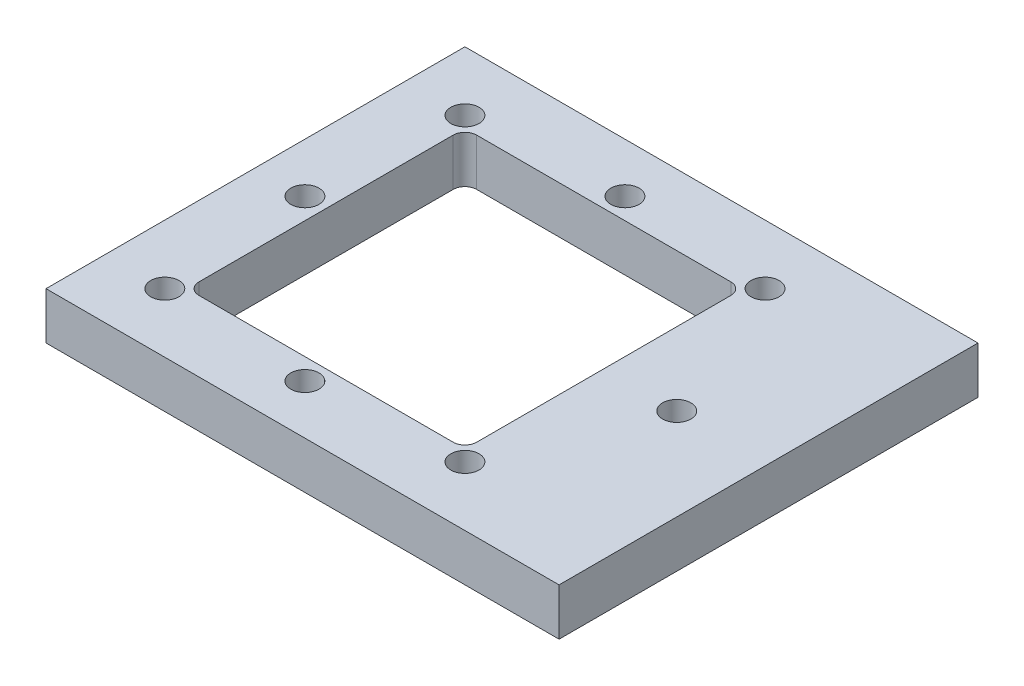
ISO-10303-21;
HEADER;
FILE_DESCRIPTION(('STEP AP214'),'2;1');
FILE_NAME('part.step','',(''),(''),'','','');
FILE_SCHEMA(('AUTOMOTIVE_DESIGN { 1 0 10303 214 1 1 1 1 }'));
ENDSEC;
DATA;
#1=APPLICATION_CONTEXT('core data for automotive mechanical design processes');
#2=APPLICATION_PROTOCOL_DEFINITION('international standard','automotive_design',2000,#1);
#3=PRODUCT_CONTEXT('',#1,'mechanical');
#4=PRODUCT('Part','Part','',(#3));
#5=PRODUCT_RELATED_PRODUCT_CATEGORY('part','',(#4));
#6=PRODUCT_DEFINITION_FORMATION('','',#4);
#7=PRODUCT_DEFINITION_CONTEXT('part definition',#1,'design');
#8=PRODUCT_DEFINITION('design','',#6,#7);
#9=PRODUCT_DEFINITION_SHAPE('','',#8);
#10=(LENGTH_UNIT() NAMED_UNIT(*) SI_UNIT(.MILLI.,.METRE.));
#11=(NAMED_UNIT(*) PLANE_ANGLE_UNIT() SI_UNIT($,.RADIAN.));
#12=(NAMED_UNIT(*) SI_UNIT($,.STERADIAN.) SOLID_ANGLE_UNIT());
#13=UNCERTAINTY_MEASURE_WITH_UNIT(LENGTH_MEASURE(1.E-05),#10,'distance_accuracy_value','');
#14=(GEOMETRIC_REPRESENTATION_CONTEXT(3) GLOBAL_UNCERTAINTY_ASSIGNED_CONTEXT((#13)) GLOBAL_UNIT_ASSIGNED_CONTEXT((#10,
#11,#12)) REPRESENTATION_CONTEXT('',''));
#15=CARTESIAN_POINT('',(0.,0.,0.));
#16=DIRECTION('',(0.,0.,1.));
#17=DIRECTION('',(1.,0.,0.));
#18=AXIS2_PLACEMENT_3D('',#15,#16,#17);
#19=CARTESIAN_POINT('',(0.,5.,0.));
#20=DIRECTION('',(1.,0.,0.));
#21=DIRECTION('',(0.,0.,-1.));
#22=AXIS2_PLACEMENT_3D('',#19,#20,#21);
#23=PLANE('',#22);
#24=DIRECTION('',(0.,0.,1.));
#25=VECTOR('',#24,1.);
#26=CARTESIAN_POINT('',(0.,0.,0.));
#27=LINE('',#26,#25);
#28=CARTESIAN_POINT('',(0.,0.,-44.5));
#29=VERTEX_POINT('',#28);
#30=CARTESIAN_POINT('',(0.,0.,0.));
#31=VERTEX_POINT('',#30);
#32=EDGE_CURVE('E148',#29,#31,#27,.T.);
#33=ORIENTED_EDGE('',*,*,#32,.T.);
#34=DIRECTION('',(0.,-1.,0.));
#35=VECTOR('',#34,1.);
#36=CARTESIAN_POINT('',(0.,5.,0.));
#37=LINE('',#36,#35);
#38=CARTESIAN_POINT('',(0.,5.,0.));
#39=VERTEX_POINT('',#38);
#40=EDGE_CURVE('E129',#39,#31,#37,.T.);
#41=ORIENTED_EDGE('',*,*,#40,.F.);
#42=DIRECTION('',(0.,0.,1.));
#43=VECTOR('',#42,1.);
#44=CARTESIAN_POINT('',(0.,5.,0.));
#45=LINE('',#44,#43);
#46=CARTESIAN_POINT('',(0.,5.,-44.5));
#47=VERTEX_POINT('',#46);
#48=EDGE_CURVE('E136',#47,#39,#45,.T.);
#49=ORIENTED_EDGE('',*,*,#48,.F.);
#50=DIRECTION('',(0.,-1.,0.));
#51=VECTOR('',#50,1.);
#52=CARTESIAN_POINT('',(0.,5.,-44.5));
#53=LINE('',#52,#51);
#54=EDGE_CURVE('E225',#47,#29,#53,.T.);
#55=ORIENTED_EDGE('',*,*,#54,.T.);
#56=EDGE_LOOP('',(#33,#41,#49,#55));
#57=FACE_BOUND('',#56,.T.);
#58=ADVANCED_FACE('F36',(#57),#23,.F.);
#59=CARTESIAN_POINT('',(0.,5.,0.));
#60=DIRECTION('',(0.,0.,-1.));
#61=DIRECTION('',(-1.,0.,0.));
#62=AXIS2_PLACEMENT_3D('',#59,#60,#61);
#63=PLANE('',#62);
#64=DIRECTION('',(1.,0.,0.));
#65=VECTOR('',#64,1.);
#66=CARTESIAN_POINT('',(0.,0.,0.));
#67=LINE('',#66,#65);
#68=CARTESIAN_POINT('',(54.5,0.,0.));
#69=VERTEX_POINT('',#68);
#70=EDGE_CURVE('E227',#31,#69,#67,.T.);
#71=ORIENTED_EDGE('',*,*,#70,.T.);
#72=DIRECTION('',(0.,-1.,0.));
#73=VECTOR('',#72,1.);
#74=CARTESIAN_POINT('',(54.5,5.,0.));
#75=LINE('',#74,#73);
#76=CARTESIAN_POINT('',(54.5,5.,0.));
#77=VERTEX_POINT('',#76);
#78=EDGE_CURVE('E132',#77,#69,#75,.T.);
#79=ORIENTED_EDGE('',*,*,#78,.F.);
#80=DIRECTION('',(1.,0.,0.));
#81=VECTOR('',#80,1.);
#82=CARTESIAN_POINT('',(0.,5.,0.));
#83=LINE('',#82,#81);
#84=EDGE_CURVE('E125',#39,#77,#83,.T.);
#85=ORIENTED_EDGE('',*,*,#84,.F.);
#86=ORIENTED_EDGE('',*,*,#40,.T.);
#87=EDGE_LOOP('',(#71,#79,#85,#86));
#88=FACE_BOUND('',#87,.T.);
#89=ADVANCED_FACE('F127',(#88),#63,.F.);
#90=CARTESIAN_POINT('',(54.5,5.,0.));
#91=DIRECTION('',(-1.,0.,0.));
#92=DIRECTION('',(0.,0.,1.));
#93=AXIS2_PLACEMENT_3D('',#90,#91,#92);
#94=PLANE('',#93);
#95=DIRECTION('',(0.,0.,-1.));
#96=VECTOR('',#95,1.);
#97=CARTESIAN_POINT('',(54.5,0.,0.));
#98=LINE('',#97,#96);
#99=CARTESIAN_POINT('',(54.5,0.,-44.5));
#100=VERTEX_POINT('',#99);
#101=EDGE_CURVE('E229',#69,#100,#98,.T.);
#102=ORIENTED_EDGE('',*,*,#101,.T.);
#103=DIRECTION('',(0.,-1.,0.));
#104=VECTOR('',#103,1.);
#105=CARTESIAN_POINT('',(54.5,5.,-44.5));
#106=LINE('',#105,#104);
#107=CARTESIAN_POINT('',(54.5,5.,-44.5));
#108=VERTEX_POINT('',#107);
#109=EDGE_CURVE('E153',#108,#100,#106,.T.);
#110=ORIENTED_EDGE('',*,*,#109,.F.);
#111=DIRECTION('',(0.,0.,-1.));
#112=VECTOR('',#111,1.);
#113=CARTESIAN_POINT('',(54.5,5.,0.));
#114=LINE('',#113,#112);
#115=EDGE_CURVE('E135',#77,#108,#114,.T.);
#116=ORIENTED_EDGE('',*,*,#115,.F.);
#117=ORIENTED_EDGE('',*,*,#78,.T.);
#118=EDGE_LOOP('',(#102,#110,#116,#117));
#119=FACE_BOUND('',#118,.T.);
#120=ADVANCED_FACE('F241',(#119),#94,.F.);
#121=CARTESIAN_POINT('',(0.,5.,-44.5));
#122=DIRECTION('',(0.,0.,1.));
#123=DIRECTION('',(1.,0.,0.));
#124=AXIS2_PLACEMENT_3D('',#121,#122,#123);
#125=PLANE('',#124);
#126=DIRECTION('',(-1.,0.,0.));
#127=VECTOR('',#126,1.);
#128=CARTESIAN_POINT('',(0.,0.,-44.5));
#129=LINE('',#128,#127);
#130=EDGE_CURVE('E145',#100,#29,#129,.T.);
#131=ORIENTED_EDGE('',*,*,#130,.T.);
#132=ORIENTED_EDGE('',*,*,#54,.F.);
#133=DIRECTION('',(-1.,0.,0.));
#134=VECTOR('',#133,1.);
#135=CARTESIAN_POINT('',(0.,5.,-44.5));
#136=LINE('',#135,#134);
#137=EDGE_CURVE('E141',#108,#47,#136,.T.);
#138=ORIENTED_EDGE('',*,*,#137,.F.);
#139=ORIENTED_EDGE('',*,*,#109,.T.);
#140=EDGE_LOOP('',(#131,#132,#138,#139));
#141=FACE_BOUND('',#140,.T.);
#142=ADVANCED_FACE('F236',(#141),#125,.F.);
#143=CARTESIAN_POINT('',(0.,5.,0.));
#144=DIRECTION('',(0.,-1.,0.));
#145=DIRECTION('',(0.,0.,-1.));
#146=AXIS2_PLACEMENT_3D('',#143,#144,#145);
#147=PLANE('',#146);
#148=CARTESIAN_POINT('',(38.18933982822,5.,-6.31066017177982));
#149=DIRECTION('',(0.,-1.,0.));
#150=DIRECTION('',(0.,0.,-1.));
#151=AXIS2_PLACEMENT_3D('',#148,#149,#150);
#152=CIRCLE('',#151,1.5);
#153=CARTESIAN_POINT('',(38.18933982822,5.,-7.81066017177982));
#154=VERTEX_POINT('',#153);
#155=EDGE_CURVE('E356',#154,#154,#152,.T.);
#156=ORIENTED_EDGE('',*,*,#155,.T.);
#157=EDGE_LOOP('',(#156));
#158=FACE_BOUND('',#157,.T.);
#159=CARTESIAN_POINT('',(6.31066017177981,5.,-6.31066017177983));
#160=DIRECTION('',(0.,-1.,0.));
#161=DIRECTION('',(0.,0.,-1.));
#162=AXIS2_PLACEMENT_3D('',#159,#160,#161);
#163=CIRCLE('',#162,1.5);
#164=CARTESIAN_POINT('',(6.31066017177981,5.,-7.81066017177983));
#165=VERTEX_POINT('',#164);
#166=EDGE_CURVE('E352',#165,#165,#163,.T.);
#167=ORIENTED_EDGE('',*,*,#166,.T.);
#168=EDGE_LOOP('',(#167));
#169=FACE_BOUND('',#168,.T.);
#170=CARTESIAN_POINT('',(38.1893398282201,5.,-38.1893398282201));
#171=DIRECTION('',(0.,-1.,0.));
#172=DIRECTION('',(0.,0.,-1.));
#173=AXIS2_PLACEMENT_3D('',#170,#171,#172);
#174=CIRCLE('',#173,1.5);
#175=CARTESIAN_POINT('',(38.1893398282201,5.,-39.6893398282201));
#176=VERTEX_POINT('',#175);
#177=EDGE_CURVE('E348',#176,#176,#174,.T.);
#178=ORIENTED_EDGE('',*,*,#177,.T.);
#179=EDGE_LOOP('',(#178));
#180=FACE_BOUND('',#179,.T.);
#181=CARTESIAN_POINT('',(6.31066017177982,5.,-38.1893398282201));
#182=DIRECTION('',(0.,-1.,0.));
#183=DIRECTION('',(0.,0.,-1.));
#184=AXIS2_PLACEMENT_3D('',#181,#182,#183);
#185=CIRCLE('',#184,1.5);
#186=CARTESIAN_POINT('',(6.31066017177982,5.,-39.6893398282201));
#187=VERTEX_POINT('',#186);
#188=EDGE_CURVE('E344',#187,#187,#185,.T.);
#189=ORIENTED_EDGE('',*,*,#188,.T.);
#190=EDGE_LOOP('',(#189));
#191=FACE_BOUND('',#190,.T.);
#192=CARTESIAN_POINT('',(22.2499999999999,5.,-5.25000000000002));
#193=DIRECTION('',(0.,-1.,0.));
#194=DIRECTION('',(0.,0.,1.));
#195=AXIS2_PLACEMENT_3D('',#192,#193,#194);
#196=CIRCLE('',#195,1.5);
#197=CARTESIAN_POINT('',(22.2499999999999,5.,-3.75000000000002));
#198=VERTEX_POINT('',#197);
#199=EDGE_CURVE('E340',#198,#198,#196,.T.);
#200=ORIENTED_EDGE('',*,*,#199,.T.);
#201=EDGE_LOOP('',(#200));
#202=FACE_BOUND('',#201,.T.);
#203=CARTESIAN_POINT('',(5.24999999999999,5.,-22.2499999999999));
#204=DIRECTION('',(0.,-1.,0.));
#205=DIRECTION('',(0.,0.,-1.));
#206=AXIS2_PLACEMENT_3D('',#203,#204,#205);
#207=CIRCLE('',#206,1.5);
#208=CARTESIAN_POINT('',(5.24999999999999,5.,-23.7499999999999));
#209=VERTEX_POINT('',#208);
#210=EDGE_CURVE('E336',#209,#209,#207,.T.);
#211=ORIENTED_EDGE('',*,*,#210,.T.);
#212=EDGE_LOOP('',(#211));
#213=FACE_BOUND('',#212,.T.);
#214=CARTESIAN_POINT('',(22.2499999999999,5.,-39.2499999999999));
#215=DIRECTION('',(0.,-1.,0.));
#216=DIRECTION('',(0.,0.,-1.));
#217=AXIS2_PLACEMENT_3D('',#214,#215,#216);
#218=CIRCLE('',#217,1.5);
#219=CARTESIAN_POINT('',(22.2499999999999,5.,-40.7499999999999));
#220=VERTEX_POINT('',#219);
#221=EDGE_CURVE('E333',#220,#220,#218,.T.);
#222=ORIENTED_EDGE('',*,*,#221,.T.);
#223=EDGE_LOOP('',(#222));
#224=FACE_BOUND('',#223,.T.);
#225=CARTESIAN_POINT('',(44.75,5.,-22.2499999999999));
#226=DIRECTION('',(0.,1.,0.));
#227=DIRECTION('',(0.,0.,1.));
#228=AXIS2_PLACEMENT_3D('',#225,#226,#227);
#229=CIRCLE('',#228,1.5);
#230=CARTESIAN_POINT('',(44.75,5.,-20.7499999999999));
#231=VERTEX_POINT('',#230);
#232=EDGE_CURVE('E209',#231,#231,#229,.T.);
#233=ORIENTED_EDGE('',*,*,#232,.F.);
#234=EDGE_LOOP('',(#233));
#235=FACE_BOUND('',#234,.T.);
#236=DIRECTION('',(1.,0.,0.));
#237=VECTOR('',#236,1.);
#238=CARTESIAN_POINT('',(7.5,5.,-7.5));
#239=LINE('',#238,#237);
#240=CARTESIAN_POINT('',(8.75,5.,-7.5));
#241=VERTEX_POINT('',#240);
#242=CARTESIAN_POINT('',(35.75,5.,-7.5));
#243=VERTEX_POINT('',#242);
#244=EDGE_CURVE('E217',#241,#243,#239,.T.);
#245=ORIENTED_EDGE('',*,*,#244,.F.);
#246=CARTESIAN_POINT('',(8.75,5.,-8.75));
#247=DIRECTION('',(0.,-1.,0.));
#248=DIRECTION('',(0.,0.,-1.));
#249=AXIS2_PLACEMENT_3D('',#246,#247,#248);
#250=CIRCLE('',#249,1.25);
#251=CARTESIAN_POINT('',(7.5,5.,-8.75));
#252=VERTEX_POINT('',#251);
#253=EDGE_CURVE('E181',#241,#252,#250,.T.);
#254=ORIENTED_EDGE('',*,*,#253,.T.);
#255=DIRECTION('',(0.,0.,1.));
#256=VECTOR('',#255,1.);
#257=CARTESIAN_POINT('',(7.5,5.,-37.));
#258=LINE('',#257,#256);
#259=CARTESIAN_POINT('',(7.5,5.,-35.75));
#260=VERTEX_POINT('',#259);
#261=EDGE_CURVE('E190',#260,#252,#258,.T.);
#262=ORIENTED_EDGE('',*,*,#261,.F.);
#263=CARTESIAN_POINT('',(8.75,5.,-35.75));
#264=DIRECTION('',(0.,-1.,0.));
#265=DIRECTION('',(0.,0.,-1.));
#266=AXIS2_PLACEMENT_3D('',#263,#264,#265);
#267=CIRCLE('',#266,1.25);
#268=CARTESIAN_POINT('',(8.75,5.,-37.));
#269=VERTEX_POINT('',#268);
#270=EDGE_CURVE('E44',#260,#269,#267,.T.);
#271=ORIENTED_EDGE('',*,*,#270,.T.);
#272=DIRECTION('',(-1.,0.,0.));
#273=VECTOR('',#272,1.);
#274=CARTESIAN_POINT('',(7.5,5.,-37.));
#275=LINE('',#274,#273);
#276=CARTESIAN_POINT('',(35.75,5.,-37.));
#277=VERTEX_POINT('',#276);
#278=EDGE_CURVE('E189',#277,#269,#275,.T.);
#279=ORIENTED_EDGE('',*,*,#278,.F.);
#280=CARTESIAN_POINT('',(35.75,5.,-35.75));
#281=DIRECTION('',(0.,-1.,0.));
#282=DIRECTION('',(0.,0.,-1.));
#283=AXIS2_PLACEMENT_3D('',#280,#281,#282);
#284=CIRCLE('',#283,1.25);
#285=CARTESIAN_POINT('',(37.,5.,-35.75));
#286=VERTEX_POINT('',#285);
#287=EDGE_CURVE('E177',#277,#286,#284,.T.);
#288=ORIENTED_EDGE('',*,*,#287,.T.);
#289=DIRECTION('',(0.,0.,-1.));
#290=VECTOR('',#289,1.);
#291=CARTESIAN_POINT('',(37.,5.,-37.));
#292=LINE('',#291,#290);
#293=CARTESIAN_POINT('',(37.,5.,-8.75));
#294=VERTEX_POINT('',#293);
#295=EDGE_CURVE('E199',#294,#286,#292,.T.);
#296=ORIENTED_EDGE('',*,*,#295,.F.);
#297=CARTESIAN_POINT('',(35.75,5.,-8.75));
#298=DIRECTION('',(0.,-1.,0.));
#299=DIRECTION('',(0.,0.,-1.));
#300=AXIS2_PLACEMENT_3D('',#297,#298,#299);
#301=CIRCLE('',#300,1.25);
#302=EDGE_CURVE('E173',#294,#243,#301,.T.);
#303=ORIENTED_EDGE('',*,*,#302,.T.);
#304=EDGE_LOOP('',(#245,#254,#262,#271,#279,#288,#296,#303));
#305=FACE_BOUND('',#304,.T.);
#306=ORIENTED_EDGE('',*,*,#48,.T.);
#307=ORIENTED_EDGE('',*,*,#84,.T.);
#308=ORIENTED_EDGE('',*,*,#115,.T.);
#309=ORIENTED_EDGE('',*,*,#137,.T.);
#310=EDGE_LOOP('',(#306,#307,#308,#309));
#311=FACE_BOUND('',#310,.T.);
#312=ADVANCED_FACE('F139',(#158,#169,#180,#191,#202,#213,#224,#235,#305,#311),#147,.F.);
#313=CARTESIAN_POINT('',(0.,0.,0.));
#314=DIRECTION('',(0.,-1.,0.));
#315=DIRECTION('',(0.,0.,-1.));
#316=AXIS2_PLACEMENT_3D('',#313,#314,#315);
#317=PLANE('',#316);
#318=CARTESIAN_POINT('',(38.18933982822,0.,-6.31066017177982));
#319=DIRECTION('',(0.,-1.,0.));
#320=DIRECTION('',(0.,0.,-1.));
#321=AXIS2_PLACEMENT_3D('',#318,#319,#320);
#322=CIRCLE('',#321,1.5);
#323=CARTESIAN_POINT('',(38.18933982822,0.,-7.81066017177982));
#324=VERTEX_POINT('',#323);
#325=EDGE_CURVE('E304',#324,#324,#322,.T.);
#326=ORIENTED_EDGE('',*,*,#325,.F.);
#327=EDGE_LOOP('',(#326));
#328=FACE_BOUND('',#327,.T.);
#329=CARTESIAN_POINT('',(6.31066017177981,0.,-6.31066017177983));
#330=DIRECTION('',(0.,-1.,0.));
#331=DIRECTION('',(0.,0.,-1.));
#332=AXIS2_PLACEMENT_3D('',#329,#330,#331);
#333=CIRCLE('',#332,1.5);
#334=CARTESIAN_POINT('',(6.31066017177981,0.,-7.81066017177983));
#335=VERTEX_POINT('',#334);
#336=EDGE_CURVE('E308',#335,#335,#333,.T.);
#337=ORIENTED_EDGE('',*,*,#336,.F.);
#338=EDGE_LOOP('',(#337));
#339=FACE_BOUND('',#338,.T.);
#340=CARTESIAN_POINT('',(38.1893398282201,0.,-38.1893398282201));
#341=DIRECTION('',(0.,-1.,0.));
#342=DIRECTION('',(0.,0.,-1.));
#343=AXIS2_PLACEMENT_3D('',#340,#341,#342);
#344=CIRCLE('',#343,1.5);
#345=CARTESIAN_POINT('',(38.1893398282201,0.,-39.6893398282201));
#346=VERTEX_POINT('',#345);
#347=EDGE_CURVE('E312',#346,#346,#344,.T.);
#348=ORIENTED_EDGE('',*,*,#347,.F.);
#349=EDGE_LOOP('',(#348));
#350=FACE_BOUND('',#349,.T.);
#351=CARTESIAN_POINT('',(6.31066017177982,0.,-38.1893398282201));
#352=DIRECTION('',(0.,-1.,0.));
#353=DIRECTION('',(0.,0.,-1.));
#354=AXIS2_PLACEMENT_3D('',#351,#352,#353);
#355=CIRCLE('',#354,1.5);
#356=CARTESIAN_POINT('',(6.31066017177982,0.,-39.6893398282201));
#357=VERTEX_POINT('',#356);
#358=EDGE_CURVE('E316',#357,#357,#355,.T.);
#359=ORIENTED_EDGE('',*,*,#358,.F.);
#360=EDGE_LOOP('',(#359));
#361=FACE_BOUND('',#360,.T.);
#362=CARTESIAN_POINT('',(22.2499999999999,0.,-5.25000000000002));
#363=DIRECTION('',(0.,-1.,0.));
#364=DIRECTION('',(0.,0.,1.));
#365=AXIS2_PLACEMENT_3D('',#362,#363,#364);
#366=CIRCLE('',#365,1.5);
#367=CARTESIAN_POINT('',(22.2499999999999,0.,-3.75000000000002));
#368=VERTEX_POINT('',#367);
#369=EDGE_CURVE('E320',#368,#368,#366,.T.);
#370=ORIENTED_EDGE('',*,*,#369,.F.);
#371=EDGE_LOOP('',(#370));
#372=FACE_BOUND('',#371,.T.);
#373=CARTESIAN_POINT('',(5.24999999999999,0.,-22.2499999999999));
#374=DIRECTION('',(0.,-1.,0.));
#375=DIRECTION('',(0.,0.,-1.));
#376=AXIS2_PLACEMENT_3D('',#373,#374,#375);
#377=CIRCLE('',#376,1.5);
#378=CARTESIAN_POINT('',(5.24999999999999,0.,-23.7499999999999));
#379=VERTEX_POINT('',#378);
#380=EDGE_CURVE('E324',#379,#379,#377,.T.);
#381=ORIENTED_EDGE('',*,*,#380,.F.);
#382=EDGE_LOOP('',(#381));
#383=FACE_BOUND('',#382,.T.);
#384=CARTESIAN_POINT('',(22.2499999999999,0.,-39.2499999999999));
#385=DIRECTION('',(0.,-1.,0.));
#386=DIRECTION('',(0.,0.,-1.));
#387=AXIS2_PLACEMENT_3D('',#384,#385,#386);
#388=CIRCLE('',#387,1.5);
#389=CARTESIAN_POINT('',(22.2499999999999,0.,-40.7499999999999));
#390=VERTEX_POINT('',#389);
#391=EDGE_CURVE('E328',#390,#390,#388,.T.);
#392=ORIENTED_EDGE('',*,*,#391,.F.);
#393=EDGE_LOOP('',(#392));
#394=FACE_BOUND('',#393,.T.);
#395=CARTESIAN_POINT('',(44.75,0.,-22.2499999999999));
#396=DIRECTION('',(0.,1.,0.));
#397=DIRECTION('',(0.,0.,1.));
#398=AXIS2_PLACEMENT_3D('',#395,#396,#397);
#399=CIRCLE('',#398,1.5);
#400=CARTESIAN_POINT('',(44.75,0.,-20.7499999999999));
#401=VERTEX_POINT('',#400);
#402=EDGE_CURVE('E218',#401,#401,#399,.T.);
#403=ORIENTED_EDGE('',*,*,#402,.T.);
#404=EDGE_LOOP('',(#403));
#405=FACE_BOUND('',#404,.T.);
#406=DIRECTION('',(-1.,0.,0.));
#407=VECTOR('',#406,1.);
#408=CARTESIAN_POINT('',(7.5,0.,-37.));
#409=LINE('',#408,#407);
#410=CARTESIAN_POINT('',(35.75,0.,-37.));
#411=VERTEX_POINT('',#410);
#412=CARTESIAN_POINT('',(8.75,0.,-37.));
#413=VERTEX_POINT('',#412);
#414=EDGE_CURVE('E214',#411,#413,#409,.T.);
#415=ORIENTED_EDGE('',*,*,#414,.T.);
#416=CARTESIAN_POINT('',(8.75,0.,-35.75));
#417=DIRECTION('',(0.,-1.,0.));
#418=DIRECTION('',(0.,0.,-1.));
#419=AXIS2_PLACEMENT_3D('',#416,#417,#418);
#420=CIRCLE('',#419,1.25);
#421=CARTESIAN_POINT('',(7.5,0.,-35.75));
#422=VERTEX_POINT('',#421);
#423=EDGE_CURVE('E11',#413,#422,#420,.F.);
#424=ORIENTED_EDGE('',*,*,#423,.T.);
#425=DIRECTION('',(0.,0.,1.));
#426=VECTOR('',#425,1.);
#427=CARTESIAN_POINT('',(7.5,0.,-37.));
#428=LINE('',#427,#426);
#429=CARTESIAN_POINT('',(7.5,0.,-8.75));
#430=VERTEX_POINT('',#429);
#431=EDGE_CURVE('E198',#422,#430,#428,.T.);
#432=ORIENTED_EDGE('',*,*,#431,.T.);
#433=CARTESIAN_POINT('',(8.75,0.,-8.75));
#434=DIRECTION('',(0.,-1.,0.));
#435=DIRECTION('',(0.,0.,-1.));
#436=AXIS2_PLACEMENT_3D('',#433,#434,#435);
#437=CIRCLE('',#436,1.25);
#438=CARTESIAN_POINT('',(8.75,0.,-7.5));
#439=VERTEX_POINT('',#438);
#440=EDGE_CURVE('E183',#430,#439,#437,.F.);
#441=ORIENTED_EDGE('',*,*,#440,.T.);
#442=DIRECTION('',(1.,0.,0.));
#443=VECTOR('',#442,1.);
#444=CARTESIAN_POINT('',(7.5,0.,-7.5));
#445=LINE('',#444,#443);
#446=CARTESIAN_POINT('',(35.75,0.,-7.5));
#447=VERTEX_POINT('',#446);
#448=EDGE_CURVE('E203',#439,#447,#445,.T.);
#449=ORIENTED_EDGE('',*,*,#448,.T.);
#450=CARTESIAN_POINT('',(35.75,0.,-8.75));
#451=DIRECTION('',(0.,-1.,0.));
#452=DIRECTION('',(0.,0.,-1.));
#453=AXIS2_PLACEMENT_3D('',#450,#451,#452);
#454=CIRCLE('',#453,1.25);
#455=CARTESIAN_POINT('',(37.,0.,-8.75));
#456=VERTEX_POINT('',#455);
#457=EDGE_CURVE('E175',#447,#456,#454,.F.);
#458=ORIENTED_EDGE('',*,*,#457,.T.);
#459=DIRECTION('',(0.,0.,-1.));
#460=VECTOR('',#459,1.);
#461=CARTESIAN_POINT('',(37.,0.,-37.));
#462=LINE('',#461,#460);
#463=CARTESIAN_POINT('',(37.,0.,-35.75));
#464=VERTEX_POINT('',#463);
#465=EDGE_CURVE('E206',#456,#464,#462,.T.);
#466=ORIENTED_EDGE('',*,*,#465,.T.);
#467=CARTESIAN_POINT('',(35.75,0.,-35.75));
#468=DIRECTION('',(0.,-1.,0.));
#469=DIRECTION('',(0.,0.,-1.));
#470=AXIS2_PLACEMENT_3D('',#467,#468,#469);
#471=CIRCLE('',#470,1.25);
#472=EDGE_CURVE('E179',#464,#411,#471,.F.);
#473=ORIENTED_EDGE('',*,*,#472,.T.);
#474=EDGE_LOOP('',(#415,#424,#432,#441,#449,#458,#466,#473));
#475=FACE_BOUND('',#474,.T.);
#476=ORIENTED_EDGE('',*,*,#32,.F.);
#477=ORIENTED_EDGE('',*,*,#130,.F.);
#478=ORIENTED_EDGE('',*,*,#101,.F.);
#479=ORIENTED_EDGE('',*,*,#70,.F.);
#480=EDGE_LOOP('',(#476,#477,#478,#479));
#481=FACE_BOUND('',#480,.T.);
#482=ADVANCED_FACE('F240',(#328,#339,#350,#361,#372,#383,#394,#405,#475,#481),#317,.T.);
#483=CARTESIAN_POINT('',(7.5,0.,-37.));
#484=DIRECTION('',(-1.,0.,0.));
#485=DIRECTION('',(0.,0.,1.));
#486=AXIS2_PLACEMENT_3D('',#483,#484,#485);
#487=PLANE('',#486);
#488=ORIENTED_EDGE('',*,*,#261,.T.);
#489=DIRECTION('',(0.,1.,0.));
#490=VECTOR('',#489,1.);
#491=CARTESIAN_POINT('',(7.5,0.,-8.75));
#492=LINE('',#491,#490);
#493=EDGE_CURVE('E51',#252,#430,#492,.F.);
#494=ORIENTED_EDGE('',*,*,#493,.T.);
#495=ORIENTED_EDGE('',*,*,#431,.F.);
#496=DIRECTION('',(0.,1.,0.));
#497=VECTOR('',#496,1.);
#498=CARTESIAN_POINT('',(7.5,5.,-35.75));
#499=LINE('',#498,#497);
#500=EDGE_CURVE('E169',#422,#260,#499,.T.);
#501=ORIENTED_EDGE('',*,*,#500,.T.);
#502=EDGE_LOOP('',(#488,#494,#495,#501));
#503=FACE_BOUND('',#502,.T.);
#504=ADVANCED_FACE('F201',(#503),#487,.F.);
#505=CARTESIAN_POINT('',(7.5,0.,-37.));
#506=DIRECTION('',(0.,0.,-1.));
#507=DIRECTION('',(-1.,0.,0.));
#508=AXIS2_PLACEMENT_3D('',#505,#506,#507);
#509=PLANE('',#508);
#510=ORIENTED_EDGE('',*,*,#414,.F.);
#511=DIRECTION('',(0.,1.,0.));
#512=VECTOR('',#511,1.);
#513=CARTESIAN_POINT('',(35.75,5.,-37.));
#514=LINE('',#513,#512);
#515=EDGE_CURVE('E166',#411,#277,#514,.T.);
#516=ORIENTED_EDGE('',*,*,#515,.T.);
#517=ORIENTED_EDGE('',*,*,#278,.T.);
#518=DIRECTION('',(0.,1.,0.));
#519=VECTOR('',#518,1.);
#520=CARTESIAN_POINT('',(8.75,0.,-37.));
#521=LINE('',#520,#519);
#522=EDGE_CURVE('E164',#269,#413,#521,.F.);
#523=ORIENTED_EDGE('',*,*,#522,.T.);
#524=EDGE_LOOP('',(#510,#516,#517,#523));
#525=FACE_BOUND('',#524,.T.);
#526=ADVANCED_FACE('F196',(#525),#509,.F.);
#527=CARTESIAN_POINT('',(37.,0.,-37.));
#528=DIRECTION('',(1.,0.,0.));
#529=DIRECTION('',(0.,0.,-1.));
#530=AXIS2_PLACEMENT_3D('',#527,#528,#529);
#531=PLANE('',#530);
#532=ORIENTED_EDGE('',*,*,#465,.F.);
#533=DIRECTION('',(0.,1.,0.));
#534=VECTOR('',#533,1.);
#535=CARTESIAN_POINT('',(37.,5.,-8.75));
#536=LINE('',#535,#534);
#537=EDGE_CURVE('E151',#456,#294,#536,.T.);
#538=ORIENTED_EDGE('',*,*,#537,.T.);
#539=ORIENTED_EDGE('',*,*,#295,.T.);
#540=DIRECTION('',(0.,1.,0.));
#541=VECTOR('',#540,1.);
#542=CARTESIAN_POINT('',(37.,0.,-35.75));
#543=LINE('',#542,#541);
#544=EDGE_CURVE('E149',#286,#464,#543,.F.);
#545=ORIENTED_EDGE('',*,*,#544,.T.);
#546=EDGE_LOOP('',(#532,#538,#539,#545));
#547=FACE_BOUND('',#546,.T.);
#548=ADVANCED_FACE('F279',(#547),#531,.F.);
#549=CARTESIAN_POINT('',(7.5,0.,-7.5));
#550=DIRECTION('',(0.,0.,1.));
#551=DIRECTION('',(1.,0.,0.));
#552=AXIS2_PLACEMENT_3D('',#549,#550,#551);
#553=PLANE('',#552);
#554=ORIENTED_EDGE('',*,*,#244,.T.);
#555=DIRECTION('',(0.,1.,0.));
#556=VECTOR('',#555,1.);
#557=CARTESIAN_POINT('',(35.75,0.,-7.5));
#558=LINE('',#557,#556);
#559=EDGE_CURVE('E162',#243,#447,#558,.F.);
#560=ORIENTED_EDGE('',*,*,#559,.T.);
#561=ORIENTED_EDGE('',*,*,#448,.F.);
#562=DIRECTION('',(0.,1.,0.));
#563=VECTOR('',#562,1.);
#564=CARTESIAN_POINT('',(8.75,5.,-7.5));
#565=LINE('',#564,#563);
#566=EDGE_CURVE('E159',#439,#241,#565,.T.);
#567=ORIENTED_EDGE('',*,*,#566,.T.);
#568=EDGE_LOOP('',(#554,#560,#561,#567));
#569=FACE_BOUND('',#568,.T.);
#570=ADVANCED_FACE('F259',(#569),#553,.F.);
#571=CARTESIAN_POINT('',(35.75,0.,-8.75));
#572=DIRECTION('',(0.,-1.,0.));
#573=DIRECTION('',(0.,0.,-1.));
#574=AXIS2_PLACEMENT_3D('',#571,#572,#573);
#575=CYLINDRICAL_SURFACE('',#574,1.25);
#576=ORIENTED_EDGE('',*,*,#457,.F.);
#577=ORIENTED_EDGE('',*,*,#559,.F.);
#578=ORIENTED_EDGE('',*,*,#302,.F.);
#579=ORIENTED_EDGE('',*,*,#537,.F.);
#580=EDGE_LOOP('',(#576,#577,#578,#579));
#581=FACE_BOUND('',#580,.T.);
#582=ADVANCED_FACE('F255',(#581),#575,.F.);
#583=CARTESIAN_POINT('',(35.75,0.,-35.75));
#584=DIRECTION('',(0.,-1.,0.));
#585=DIRECTION('',(0.,0.,-1.));
#586=AXIS2_PLACEMENT_3D('',#583,#584,#585);
#587=CYLINDRICAL_SURFACE('',#586,1.25);
#588=ORIENTED_EDGE('',*,*,#472,.F.);
#589=ORIENTED_EDGE('',*,*,#544,.F.);
#590=ORIENTED_EDGE('',*,*,#287,.F.);
#591=ORIENTED_EDGE('',*,*,#515,.F.);
#592=EDGE_LOOP('',(#588,#589,#590,#591));
#593=FACE_BOUND('',#592,.T.);
#594=ADVANCED_FACE('F258',(#593),#587,.F.);
#595=CARTESIAN_POINT('',(8.75,0.,-8.75));
#596=DIRECTION('',(0.,-1.,0.));
#597=DIRECTION('',(0.,0.,-1.));
#598=AXIS2_PLACEMENT_3D('',#595,#596,#597);
#599=CYLINDRICAL_SURFACE('',#598,1.25);
#600=ORIENTED_EDGE('',*,*,#440,.F.);
#601=ORIENTED_EDGE('',*,*,#493,.F.);
#602=ORIENTED_EDGE('',*,*,#253,.F.);
#603=ORIENTED_EDGE('',*,*,#566,.F.);
#604=EDGE_LOOP('',(#600,#601,#602,#603));
#605=FACE_BOUND('',#604,.T.);
#606=ADVANCED_FACE('F262',(#605),#599,.F.);
#607=CARTESIAN_POINT('',(8.75,0.,-35.75));
#608=DIRECTION('',(0.,-1.,0.));
#609=DIRECTION('',(0.,0.,-1.));
#610=AXIS2_PLACEMENT_3D('',#607,#608,#609);
#611=CYLINDRICAL_SURFACE('',#610,1.25);
#612=ORIENTED_EDGE('',*,*,#423,.F.);
#613=ORIENTED_EDGE('',*,*,#522,.F.);
#614=ORIENTED_EDGE('',*,*,#270,.F.);
#615=ORIENTED_EDGE('',*,*,#500,.F.);
#616=EDGE_LOOP('',(#612,#613,#614,#615));
#617=FACE_BOUND('',#616,.T.);
#618=ADVANCED_FACE('F38',(#617),#611,.F.);
#619=CARTESIAN_POINT('',(44.75,0.,-22.2499999999999));
#620=DIRECTION('',(0.,1.,0.));
#621=DIRECTION('',(0.,0.,1.));
#622=AXIS2_PLACEMENT_3D('',#619,#620,#621);
#623=CYLINDRICAL_SURFACE('',#622,1.5);
#624=ORIENTED_EDGE('',*,*,#402,.F.);
#625=EDGE_LOOP('',(#624));
#626=FACE_BOUND('',#625,.T.);
#627=ORIENTED_EDGE('',*,*,#232,.T.);
#628=EDGE_LOOP('',(#627));
#629=FACE_BOUND('',#628,.T.);
#630=ADVANCED_FACE('F269',(#626,#629),#623,.F.);
#631=CARTESIAN_POINT('',(22.2499999999999,5.,-39.2499999999999));
#632=DIRECTION('',(0.,-1.,0.));
#633=DIRECTION('',(0.,0.,-1.));
#634=AXIS2_PLACEMENT_3D('',#631,#632,#633);
#635=CYLINDRICAL_SURFACE('',#634,1.5);
#636=ORIENTED_EDGE('',*,*,#221,.F.);
#637=EDGE_LOOP('',(#636));
#638=FACE_BOUND('',#637,.T.);
#639=ORIENTED_EDGE('',*,*,#391,.T.);
#640=EDGE_LOOP('',(#639));
#641=FACE_BOUND('',#640,.T.);
#642=ADVANCED_FACE('F390',(#638,#641),#635,.F.);
#643=CARTESIAN_POINT('',(5.24999999999999,5.,-22.2499999999999));
#644=DIRECTION('',(0.,-1.,0.));
#645=DIRECTION('',(0.,0.,-1.));
#646=AXIS2_PLACEMENT_3D('',#643,#644,#645);
#647=CYLINDRICAL_SURFACE('',#646,1.5);
#648=ORIENTED_EDGE('',*,*,#210,.F.);
#649=EDGE_LOOP('',(#648));
#650=FACE_BOUND('',#649,.T.);
#651=ORIENTED_EDGE('',*,*,#380,.T.);
#652=EDGE_LOOP('',(#651));
#653=FACE_BOUND('',#652,.T.);
#654=ADVANCED_FACE('F386',(#650,#653),#647,.F.);
#655=CARTESIAN_POINT('',(22.2499999999999,5.,-5.25000000000002));
#656=DIRECTION('',(0.,-1.,0.));
#657=DIRECTION('',(0.,0.,-1.));
#658=AXIS2_PLACEMENT_3D('',#655,#656,#657);
#659=CYLINDRICAL_SURFACE('',#658,1.5);
#660=ORIENTED_EDGE('',*,*,#199,.F.);
#661=EDGE_LOOP('',(#660));
#662=FACE_BOUND('',#661,.T.);
#663=ORIENTED_EDGE('',*,*,#369,.T.);
#664=EDGE_LOOP('',(#663));
#665=FACE_BOUND('',#664,.T.);
#666=ADVANCED_FACE('F382',(#662,#665),#659,.F.);
#667=CARTESIAN_POINT('',(6.31066017177982,5.,-38.1893398282201));
#668=DIRECTION('',(0.,-1.,0.));
#669=DIRECTION('',(0.,0.,-1.));
#670=AXIS2_PLACEMENT_3D('',#667,#668,#669);
#671=CYLINDRICAL_SURFACE('',#670,1.5);
#672=ORIENTED_EDGE('',*,*,#188,.F.);
#673=EDGE_LOOP('',(#672));
#674=FACE_BOUND('',#673,.T.);
#675=ORIENTED_EDGE('',*,*,#358,.T.);
#676=EDGE_LOOP('',(#675));
#677=FACE_BOUND('',#676,.T.);
#678=ADVANCED_FACE('F378',(#674,#677),#671,.F.);
#679=CARTESIAN_POINT('',(38.1893398282201,5.,-38.1893398282201));
#680=DIRECTION('',(0.,-1.,0.));
#681=DIRECTION('',(0.,0.,-1.));
#682=AXIS2_PLACEMENT_3D('',#679,#680,#681);
#683=CYLINDRICAL_SURFACE('',#682,1.5);
#684=ORIENTED_EDGE('',*,*,#177,.F.);
#685=EDGE_LOOP('',(#684));
#686=FACE_BOUND('',#685,.T.);
#687=ORIENTED_EDGE('',*,*,#347,.T.);
#688=EDGE_LOOP('',(#687));
#689=FACE_BOUND('',#688,.T.);
#690=ADVANCED_FACE('F372',(#686,#689),#683,.F.);
#691=CARTESIAN_POINT('',(6.31066017177981,5.,-6.31066017177983));
#692=DIRECTION('',(0.,-1.,0.));
#693=DIRECTION('',(0.,0.,-1.));
#694=AXIS2_PLACEMENT_3D('',#691,#692,#693);
#695=CYLINDRICAL_SURFACE('',#694,1.5);
#696=ORIENTED_EDGE('',*,*,#166,.F.);
#697=EDGE_LOOP('',(#696));
#698=FACE_BOUND('',#697,.T.);
#699=ORIENTED_EDGE('',*,*,#336,.T.);
#700=EDGE_LOOP('',(#699));
#701=FACE_BOUND('',#700,.T.);
#702=ADVANCED_FACE('F367',(#698,#701),#695,.F.);
#703=CARTESIAN_POINT('',(38.18933982822,5.,-6.31066017177982));
#704=DIRECTION('',(0.,-1.,0.));
#705=DIRECTION('',(0.,0.,-1.));
#706=AXIS2_PLACEMENT_3D('',#703,#704,#705);
#707=CYLINDRICAL_SURFACE('',#706,1.5);
#708=ORIENTED_EDGE('',*,*,#155,.F.);
#709=EDGE_LOOP('',(#708));
#710=FACE_BOUND('',#709,.T.);
#711=ORIENTED_EDGE('',*,*,#325,.T.);
#712=EDGE_LOOP('',(#711));
#713=FACE_BOUND('',#712,.T.);
#714=ADVANCED_FACE('F364',(#710,#713),#707,.F.);
#715=CLOSED_SHELL('',(#58,#89,#120,#142,#312,#482,#504,#526,#548,#570,#582,#594,#606,#618,#630,
#642,#654,#666,#678,#690,#702,#714));
#716=MANIFOLD_SOLID_BREP('B2',#715);
#717=ADVANCED_BREP_SHAPE_REPRESENTATION('',(#18,#716),#14);
#718=SHAPE_DEFINITION_REPRESENTATION(#9,#717);
ENDSEC;
END-ISO-10303-21;
